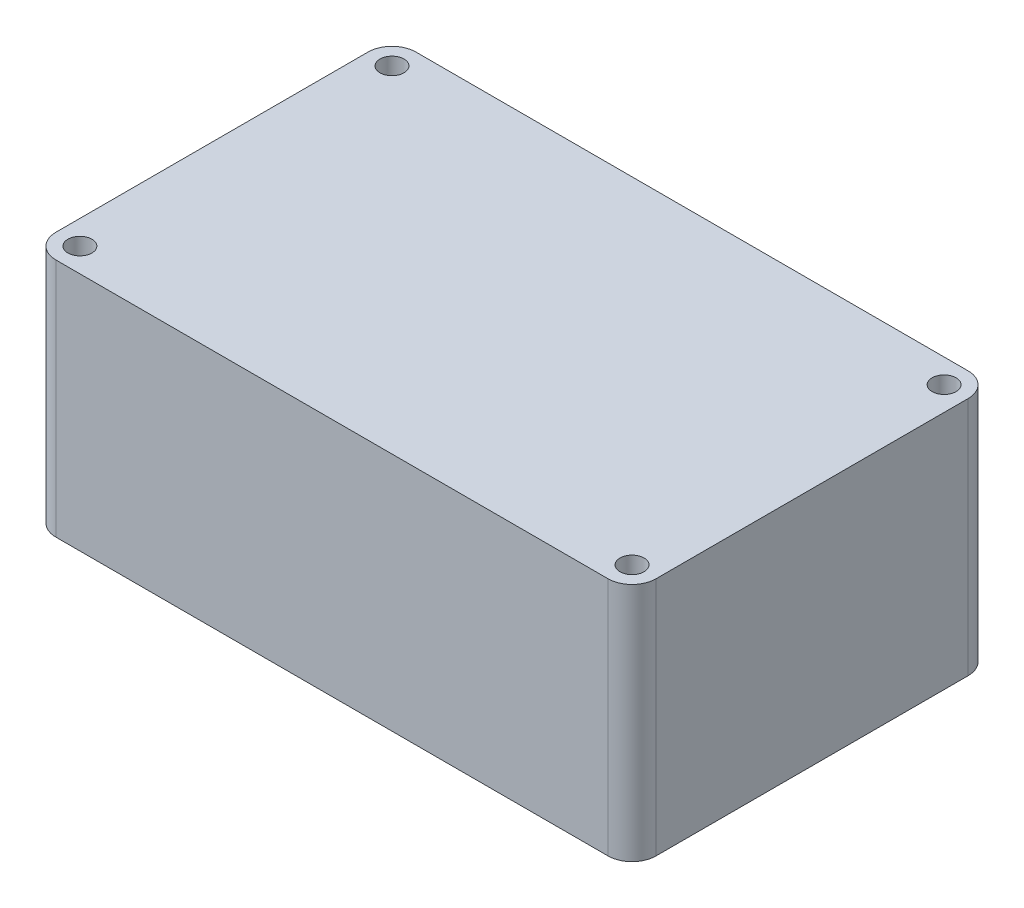
ISO-10303-21;
HEADER;
FILE_DESCRIPTION(('STEP AP214'),'2;1');
FILE_NAME('part.step','',(''),(''),'','','');
FILE_SCHEMA(('AUTOMOTIVE_DESIGN { 1 0 10303 214 1 1 1 1 }'));
ENDSEC;
DATA;
#1=APPLICATION_CONTEXT('core data for automotive mechanical design processes');
#2=APPLICATION_PROTOCOL_DEFINITION('international standard','automotive_design',2000,#1);
#3=PRODUCT_CONTEXT('',#1,'mechanical');
#4=PRODUCT('Part','Part','',(#3));
#5=PRODUCT_RELATED_PRODUCT_CATEGORY('part','',(#4));
#6=PRODUCT_DEFINITION_FORMATION('','',#4);
#7=PRODUCT_DEFINITION_CONTEXT('part definition',#1,'design');
#8=PRODUCT_DEFINITION('design','',#6,#7);
#9=PRODUCT_DEFINITION_SHAPE('','',#8);
#10=(LENGTH_UNIT() NAMED_UNIT(*) SI_UNIT(.MILLI.,.METRE.));
#11=(NAMED_UNIT(*) PLANE_ANGLE_UNIT() SI_UNIT($,.RADIAN.));
#12=(NAMED_UNIT(*) SI_UNIT($,.STERADIAN.) SOLID_ANGLE_UNIT());
#13=UNCERTAINTY_MEASURE_WITH_UNIT(LENGTH_MEASURE(1.E-05),#10,'distance_accuracy_value','');
#14=(GEOMETRIC_REPRESENTATION_CONTEXT(3) GLOBAL_UNCERTAINTY_ASSIGNED_CONTEXT((#13)) GLOBAL_UNIT_ASSIGNED_CONTEXT((#10,
#11,#12)) REPRESENTATION_CONTEXT('',''));
#15=CARTESIAN_POINT('',(0.,0.,0.));
#16=DIRECTION('',(0.,0.,1.));
#17=DIRECTION('',(1.,0.,0.));
#18=AXIS2_PLACEMENT_3D('',#15,#16,#17);
#19=CARTESIAN_POINT('',(-125.,100.,-75.));
#20=DIRECTION('',(1.,0.,0.));
#21=DIRECTION('',(0.,0.,-1.));
#22=AXIS2_PLACEMENT_3D('',#19,#20,#21);
#23=PLANE('',#22);
#24=DIRECTION('',(0.,0.,1.));
#25=VECTOR('',#24,1.);
#26=CARTESIAN_POINT('',(-125.,100.,-75.));
#27=LINE('',#26,#25);
#28=CARTESIAN_POINT('',(-125.,100.,-65.));
#29=VERTEX_POINT('',#28);
#30=CARTESIAN_POINT('',(-125.,100.,65.));
#31=VERTEX_POINT('',#30);
#32=EDGE_CURVE('E124',#29,#31,#27,.T.);
#33=ORIENTED_EDGE('',*,*,#32,.F.);
#34=DIRECTION('',(0.,-1.,0.));
#35=VECTOR('',#34,1.);
#36=CARTESIAN_POINT('',(-125.,100.,-65.));
#37=LINE('',#36,#35);
#38=CARTESIAN_POINT('',(-125.,0.,-65.));
#39=VERTEX_POINT('',#38);
#40=EDGE_CURVE('E109',#29,#39,#37,.T.);
#41=ORIENTED_EDGE('',*,*,#40,.T.);
#42=DIRECTION('',(0.,0.,1.));
#43=VECTOR('',#42,1.);
#44=CARTESIAN_POINT('',(-125.,0.,-75.));
#45=LINE('',#44,#43);
#46=CARTESIAN_POINT('',(-125.,0.,65.));
#47=VERTEX_POINT('',#46);
#48=EDGE_CURVE('E121',#39,#47,#45,.T.);
#49=ORIENTED_EDGE('',*,*,#48,.T.);
#50=DIRECTION('',(0.,-1.,0.));
#51=VECTOR('',#50,1.);
#52=CARTESIAN_POINT('',(-125.,100.,65.));
#53=LINE('',#52,#51);
#54=EDGE_CURVE('E126',#47,#31,#53,.F.);
#55=ORIENTED_EDGE('',*,*,#54,.T.);
#56=EDGE_LOOP('',(#33,#41,#49,#55));
#57=FACE_BOUND('',#56,.T.);
#58=ADVANCED_FACE('F39',(#57),#23,.F.);
#59=CARTESIAN_POINT('',(-125.,100.,75.));
#60=DIRECTION('',(0.,0.,-1.));
#61=DIRECTION('',(-1.,0.,0.));
#62=AXIS2_PLACEMENT_3D('',#59,#60,#61);
#63=PLANE('',#62);
#64=DIRECTION('',(1.,0.,0.));
#65=VECTOR('',#64,1.);
#66=CARTESIAN_POINT('',(-125.,0.,75.));
#67=LINE('',#66,#65);
#68=CARTESIAN_POINT('',(-115.,0.,75.));
#69=VERTEX_POINT('',#68);
#70=CARTESIAN_POINT('',(115.,0.,75.));
#71=VERTEX_POINT('',#70);
#72=EDGE_CURVE('E130',#69,#71,#67,.T.);
#73=ORIENTED_EDGE('',*,*,#72,.T.);
#74=DIRECTION('',(0.,-1.,0.));
#75=VECTOR('',#74,1.);
#76=CARTESIAN_POINT('',(115.,100.,75.));
#77=LINE('',#76,#75);
#78=CARTESIAN_POINT('',(115.,100.,75.));
#79=VERTEX_POINT('',#78);
#80=EDGE_CURVE('E11',#71,#79,#77,.F.);
#81=ORIENTED_EDGE('',*,*,#80,.T.);
#82=DIRECTION('',(1.,0.,0.));
#83=VECTOR('',#82,1.);
#84=CARTESIAN_POINT('',(-125.,100.,75.));
#85=LINE('',#84,#83);
#86=CARTESIAN_POINT('',(-115.,100.,75.));
#87=VERTEX_POINT('',#86);
#88=EDGE_CURVE('E170',#87,#79,#85,.T.);
#89=ORIENTED_EDGE('',*,*,#88,.F.);
#90=DIRECTION('',(0.,-1.,0.));
#91=VECTOR('',#90,1.);
#92=CARTESIAN_POINT('',(-115.,100.,75.));
#93=LINE('',#92,#91);
#94=EDGE_CURVE('E47',#87,#69,#93,.T.);
#95=ORIENTED_EDGE('',*,*,#94,.T.);
#96=EDGE_LOOP('',(#73,#81,#89,#95));
#97=FACE_BOUND('',#96,.T.);
#98=ADVANCED_FACE('F168',(#97),#63,.F.);
#99=CARTESIAN_POINT('',(125.,100.,-75.));
#100=DIRECTION('',(-1.,0.,0.));
#101=DIRECTION('',(0.,0.,1.));
#102=AXIS2_PLACEMENT_3D('',#99,#100,#101);
#103=PLANE('',#102);
#104=DIRECTION('',(0.,0.,-1.));
#105=VECTOR('',#104,1.);
#106=CARTESIAN_POINT('',(125.,0.,-75.));
#107=LINE('',#106,#105);
#108=CARTESIAN_POINT('',(125.,0.,65.));
#109=VERTEX_POINT('',#108);
#110=CARTESIAN_POINT('',(125.,0.,-65.));
#111=VERTEX_POINT('',#110);
#112=EDGE_CURVE('E134',#109,#111,#107,.T.);
#113=ORIENTED_EDGE('',*,*,#112,.T.);
#114=DIRECTION('',(0.,-1.,0.));
#115=VECTOR('',#114,1.);
#116=CARTESIAN_POINT('',(125.,100.,-65.));
#117=LINE('',#116,#115);
#118=CARTESIAN_POINT('',(125.,100.,-65.));
#119=VERTEX_POINT('',#118);
#120=EDGE_CURVE('E54',#111,#119,#117,.F.);
#121=ORIENTED_EDGE('',*,*,#120,.T.);
#122=DIRECTION('',(0.,0.,-1.));
#123=VECTOR('',#122,1.);
#124=CARTESIAN_POINT('',(125.,100.,-75.));
#125=LINE('',#124,#123);
#126=CARTESIAN_POINT('',(125.,100.,65.));
#127=VERTEX_POINT('',#126);
#128=EDGE_CURVE('E178',#127,#119,#125,.T.);
#129=ORIENTED_EDGE('',*,*,#128,.F.);
#130=DIRECTION('',(0.,-1.,0.));
#131=VECTOR('',#130,1.);
#132=CARTESIAN_POINT('',(125.,100.,65.));
#133=LINE('',#132,#131);
#134=EDGE_CURVE('E161',#127,#109,#133,.T.);
#135=ORIENTED_EDGE('',*,*,#134,.T.);
#136=EDGE_LOOP('',(#113,#121,#129,#135));
#137=FACE_BOUND('',#136,.T.);
#138=ADVANCED_FACE('F177',(#137),#103,.F.);
#139=CARTESIAN_POINT('',(-125.,100.,-75.));
#140=DIRECTION('',(0.,0.,1.));
#141=DIRECTION('',(1.,0.,0.));
#142=AXIS2_PLACEMENT_3D('',#139,#140,#141);
#143=PLANE('',#142);
#144=DIRECTION('',(-1.,0.,0.));
#145=VECTOR('',#144,1.);
#146=CARTESIAN_POINT('',(-125.,0.,-75.));
#147=LINE('',#146,#145);
#148=CARTESIAN_POINT('',(115.,0.,-75.));
#149=VERTEX_POINT('',#148);
#150=CARTESIAN_POINT('',(-115.,0.,-75.));
#151=VERTEX_POINT('',#150);
#152=EDGE_CURVE('E144',#149,#151,#147,.T.);
#153=ORIENTED_EDGE('',*,*,#152,.T.);
#154=DIRECTION('',(0.,-1.,0.));
#155=VECTOR('',#154,1.);
#156=CARTESIAN_POINT('',(-115.,100.,-75.));
#157=LINE('',#156,#155);
#158=CARTESIAN_POINT('',(-115.,100.,-75.));
#159=VERTEX_POINT('',#158);
#160=EDGE_CURVE('E110',#151,#159,#157,.F.);
#161=ORIENTED_EDGE('',*,*,#160,.T.);
#162=DIRECTION('',(-1.,0.,0.));
#163=VECTOR('',#162,1.);
#164=CARTESIAN_POINT('',(-125.,100.,-75.));
#165=LINE('',#164,#163);
#166=CARTESIAN_POINT('',(115.,100.,-75.));
#167=VERTEX_POINT('',#166);
#168=EDGE_CURVE('E140',#167,#159,#165,.T.);
#169=ORIENTED_EDGE('',*,*,#168,.F.);
#170=DIRECTION('',(0.,-1.,0.));
#171=VECTOR('',#170,1.);
#172=CARTESIAN_POINT('',(115.,100.,-75.));
#173=LINE('',#172,#171);
#174=EDGE_CURVE('E115',#167,#149,#173,.T.);
#175=ORIENTED_EDGE('',*,*,#174,.T.);
#176=EDGE_LOOP('',(#153,#161,#169,#175));
#177=FACE_BOUND('',#176,.T.);
#178=ADVANCED_FACE('F217',(#177),#143,.F.);
#179=CARTESIAN_POINT('',(0.,100.,0.));
#180=DIRECTION('',(0.,1.,0.));
#181=DIRECTION('',(0.,0.,1.));
#182=AXIS2_PLACEMENT_3D('',#179,#180,#181);
#183=PLANE('',#182);
#184=CARTESIAN_POINT('',(115.,100.,65.));
#185=DIRECTION('',(0.,1.,0.));
#186=DIRECTION('',(0.,0.,-1.));
#187=AXIS2_PLACEMENT_3D('',#184,#185,#186);
#188=CIRCLE('',#187,5.00000000000001);
#189=CARTESIAN_POINT('',(115.,100.,60.));
#190=VERTEX_POINT('',#189);
#191=EDGE_CURVE('E199',#190,#190,#188,.T.);
#192=ORIENTED_EDGE('',*,*,#191,.F.);
#193=EDGE_LOOP('',(#192));
#194=FACE_BOUND('',#193,.T.);
#195=CARTESIAN_POINT('',(-115.,100.,65.));
#196=DIRECTION('',(0.,-1.,0.));
#197=DIRECTION('',(0.,0.,-1.));
#198=AXIS2_PLACEMENT_3D('',#195,#196,#197);
#199=CIRCLE('',#198,5.00000000000001);
#200=CARTESIAN_POINT('',(-115.,100.,60.));
#201=VERTEX_POINT('',#200);
#202=EDGE_CURVE('E193',#201,#201,#199,.T.);
#203=ORIENTED_EDGE('',*,*,#202,.T.);
#204=EDGE_LOOP('',(#203));
#205=FACE_BOUND('',#204,.T.);
#206=CARTESIAN_POINT('',(115.,100.,-65.));
#207=DIRECTION('',(0.,-1.,0.));
#208=DIRECTION('',(0.,0.,1.));
#209=AXIS2_PLACEMENT_3D('',#206,#207,#208);
#210=CIRCLE('',#209,5.00000000000001);
#211=CARTESIAN_POINT('',(115.,100.,-60.));
#212=VERTEX_POINT('',#211);
#213=EDGE_CURVE('E187',#212,#212,#210,.T.);
#214=ORIENTED_EDGE('',*,*,#213,.T.);
#215=EDGE_LOOP('',(#214));
#216=FACE_BOUND('',#215,.T.);
#217=CARTESIAN_POINT('',(-115.,100.,-65.));
#218=DIRECTION('',(0.,1.,0.));
#219=DIRECTION('',(0.,0.,1.));
#220=AXIS2_PLACEMENT_3D('',#217,#218,#219);
#221=CIRCLE('',#220,5.00000000000001);
#222=CARTESIAN_POINT('',(-115.,100.,-60.));
#223=VERTEX_POINT('',#222);
#224=EDGE_CURVE('E137',#223,#223,#221,.T.);
#225=ORIENTED_EDGE('',*,*,#224,.F.);
#226=EDGE_LOOP('',(#225));
#227=FACE_BOUND('',#226,.T.);
#228=ORIENTED_EDGE('',*,*,#168,.T.);
#229=CARTESIAN_POINT('',(-115.,100.,-65.));
#230=DIRECTION('',(0.,1.,0.));
#231=DIRECTION('',(0.,0.,1.));
#232=AXIS2_PLACEMENT_3D('',#229,#230,#231);
#233=CIRCLE('',#232,10.);
#234=EDGE_CURVE('E159',#159,#29,#233,.T.);
#235=ORIENTED_EDGE('',*,*,#234,.T.);
#236=ORIENTED_EDGE('',*,*,#32,.T.);
#237=CARTESIAN_POINT('',(-115.,100.,65.));
#238=DIRECTION('',(0.,1.,0.));
#239=DIRECTION('',(0.,0.,1.));
#240=AXIS2_PLACEMENT_3D('',#237,#238,#239);
#241=CIRCLE('',#240,10.);
#242=EDGE_CURVE('E154',#31,#87,#241,.T.);
#243=ORIENTED_EDGE('',*,*,#242,.T.);
#244=ORIENTED_EDGE('',*,*,#88,.T.);
#245=CARTESIAN_POINT('',(115.,100.,65.));
#246=DIRECTION('',(0.,1.,0.));
#247=DIRECTION('',(0.,0.,1.));
#248=AXIS2_PLACEMENT_3D('',#245,#246,#247);
#249=CIRCLE('',#248,10.);
#250=EDGE_CURVE('E61',#79,#127,#249,.T.);
#251=ORIENTED_EDGE('',*,*,#250,.T.);
#252=ORIENTED_EDGE('',*,*,#128,.T.);
#253=CARTESIAN_POINT('',(115.,100.,-65.));
#254=DIRECTION('',(0.,1.,0.));
#255=DIRECTION('',(0.,0.,1.));
#256=AXIS2_PLACEMENT_3D('',#253,#254,#255);
#257=CIRCLE('',#256,10.);
#258=EDGE_CURVE('E157',#119,#167,#257,.T.);
#259=ORIENTED_EDGE('',*,*,#258,.T.);
#260=EDGE_LOOP('',(#228,#235,#236,#243,#244,#251,#252,#259));
#261=FACE_BOUND('',#260,.T.);
#262=ADVANCED_FACE('F214',(#194,#205,#216,#227,#261),#183,.T.);
#263=CARTESIAN_POINT('',(0.,0.,0.));
#264=DIRECTION('',(0.,1.,0.));
#265=DIRECTION('',(0.,0.,1.));
#266=AXIS2_PLACEMENT_3D('',#263,#264,#265);
#267=PLANE('',#266);
#268=CARTESIAN_POINT('',(115.,0.,65.));
#269=DIRECTION('',(0.,1.,0.));
#270=DIRECTION('',(0.,0.,-1.));
#271=AXIS2_PLACEMENT_3D('',#268,#269,#270);
#272=CIRCLE('',#271,5.00000000000001);
#273=CARTESIAN_POINT('',(115.,0.,60.));
#274=VERTEX_POINT('',#273);
#275=EDGE_CURVE('E196',#274,#274,#272,.T.);
#276=ORIENTED_EDGE('',*,*,#275,.T.);
#277=EDGE_LOOP('',(#276));
#278=FACE_BOUND('',#277,.T.);
#279=CARTESIAN_POINT('',(-115.,0.,65.));
#280=DIRECTION('',(0.,-1.,0.));
#281=DIRECTION('',(0.,0.,-1.));
#282=AXIS2_PLACEMENT_3D('',#279,#280,#281);
#283=CIRCLE('',#282,5.00000000000001);
#284=CARTESIAN_POINT('',(-115.,0.,60.));
#285=VERTEX_POINT('',#284);
#286=EDGE_CURVE('E190',#285,#285,#283,.T.);
#287=ORIENTED_EDGE('',*,*,#286,.F.);
#288=EDGE_LOOP('',(#287));
#289=FACE_BOUND('',#288,.T.);
#290=CARTESIAN_POINT('',(115.,0.,-65.));
#291=DIRECTION('',(0.,-1.,0.));
#292=DIRECTION('',(0.,0.,1.));
#293=AXIS2_PLACEMENT_3D('',#290,#291,#292);
#294=CIRCLE('',#293,5.00000000000001);
#295=CARTESIAN_POINT('',(115.,0.,-60.));
#296=VERTEX_POINT('',#295);
#297=EDGE_CURVE('E185',#296,#296,#294,.T.);
#298=ORIENTED_EDGE('',*,*,#297,.F.);
#299=EDGE_LOOP('',(#298));
#300=FACE_BOUND('',#299,.T.);
#301=CARTESIAN_POINT('',(-115.,0.,-65.));
#302=DIRECTION('',(0.,1.,0.));
#303=DIRECTION('',(0.,0.,1.));
#304=AXIS2_PLACEMENT_3D('',#301,#302,#303);
#305=CIRCLE('',#304,5.00000000000001);
#306=CARTESIAN_POINT('',(-115.,0.,-60.));
#307=VERTEX_POINT('',#306);
#308=EDGE_CURVE('E131',#307,#307,#305,.T.);
#309=ORIENTED_EDGE('',*,*,#308,.T.);
#310=EDGE_LOOP('',(#309));
#311=FACE_BOUND('',#310,.T.);
#312=ORIENTED_EDGE('',*,*,#48,.F.);
#313=CARTESIAN_POINT('',(-115.,0.,-65.));
#314=DIRECTION('',(0.,1.,0.));
#315=DIRECTION('',(0.,0.,1.));
#316=AXIS2_PLACEMENT_3D('',#313,#314,#315);
#317=CIRCLE('',#316,10.);
#318=EDGE_CURVE('E105',#39,#151,#317,.F.);
#319=ORIENTED_EDGE('',*,*,#318,.T.);
#320=ORIENTED_EDGE('',*,*,#152,.F.);
#321=CARTESIAN_POINT('',(115.,0.,-65.));
#322=DIRECTION('',(0.,1.,0.));
#323=DIRECTION('',(0.,0.,1.));
#324=AXIS2_PLACEMENT_3D('',#321,#322,#323);
#325=CIRCLE('',#324,10.);
#326=EDGE_CURVE('E116',#149,#111,#325,.F.);
#327=ORIENTED_EDGE('',*,*,#326,.T.);
#328=ORIENTED_EDGE('',*,*,#112,.F.);
#329=CARTESIAN_POINT('',(115.,0.,65.));
#330=DIRECTION('',(0.,1.,0.));
#331=DIRECTION('',(0.,0.,1.));
#332=AXIS2_PLACEMENT_3D('',#329,#330,#331);
#333=CIRCLE('',#332,10.);
#334=EDGE_CURVE('E148',#109,#71,#333,.F.);
#335=ORIENTED_EDGE('',*,*,#334,.T.);
#336=ORIENTED_EDGE('',*,*,#72,.F.);
#337=CARTESIAN_POINT('',(-115.,0.,65.));
#338=DIRECTION('',(0.,1.,0.));
#339=DIRECTION('',(0.,0.,1.));
#340=AXIS2_PLACEMENT_3D('',#337,#338,#339);
#341=CIRCLE('',#340,10.);
#342=EDGE_CURVE('E125',#69,#47,#341,.F.);
#343=ORIENTED_EDGE('',*,*,#342,.T.);
#344=EDGE_LOOP('',(#312,#319,#320,#327,#328,#335,#336,#343));
#345=FACE_BOUND('',#344,.T.);
#346=ADVANCED_FACE('F128',(#278,#289,#300,#311,#345),#267,.F.);
#347=CARTESIAN_POINT('',(-115.,100.,-65.));
#348=DIRECTION('',(0.,-1.,0.));
#349=DIRECTION('',(0.,0.,-1.));
#350=AXIS2_PLACEMENT_3D('',#347,#348,#349);
#351=CYLINDRICAL_SURFACE('',#350,10.);
#352=ORIENTED_EDGE('',*,*,#234,.F.);
#353=ORIENTED_EDGE('',*,*,#160,.F.);
#354=ORIENTED_EDGE('',*,*,#318,.F.);
#355=ORIENTED_EDGE('',*,*,#40,.F.);
#356=EDGE_LOOP('',(#352,#353,#354,#355));
#357=FACE_BOUND('',#356,.T.);
#358=ADVANCED_FACE('F108',(#357),#351,.T.);
#359=CARTESIAN_POINT('',(115.,100.,-65.));
#360=DIRECTION('',(0.,-1.,0.));
#361=DIRECTION('',(0.,0.,-1.));
#362=AXIS2_PLACEMENT_3D('',#359,#360,#361);
#363=CYLINDRICAL_SURFACE('',#362,10.);
#364=ORIENTED_EDGE('',*,*,#258,.F.);
#365=ORIENTED_EDGE('',*,*,#120,.F.);
#366=ORIENTED_EDGE('',*,*,#326,.F.);
#367=ORIENTED_EDGE('',*,*,#174,.F.);
#368=EDGE_LOOP('',(#364,#365,#366,#367));
#369=FACE_BOUND('',#368,.T.);
#370=ADVANCED_FACE('F228',(#369),#363,.T.);
#371=CARTESIAN_POINT('',(115.,100.,65.));
#372=DIRECTION('',(0.,-1.,0.));
#373=DIRECTION('',(0.,0.,-1.));
#374=AXIS2_PLACEMENT_3D('',#371,#372,#373);
#375=CYLINDRICAL_SURFACE('',#374,10.);
#376=ORIENTED_EDGE('',*,*,#250,.F.);
#377=ORIENTED_EDGE('',*,*,#80,.F.);
#378=ORIENTED_EDGE('',*,*,#334,.F.);
#379=ORIENTED_EDGE('',*,*,#134,.F.);
#380=EDGE_LOOP('',(#376,#377,#378,#379));
#381=FACE_BOUND('',#380,.T.);
#382=ADVANCED_FACE('F176',(#381),#375,.T.);
#383=CARTESIAN_POINT('',(-115.,100.,65.));
#384=DIRECTION('',(0.,-1.,0.));
#385=DIRECTION('',(0.,0.,-1.));
#386=AXIS2_PLACEMENT_3D('',#383,#384,#385);
#387=CYLINDRICAL_SURFACE('',#386,10.);
#388=ORIENTED_EDGE('',*,*,#242,.F.);
#389=ORIENTED_EDGE('',*,*,#54,.F.);
#390=ORIENTED_EDGE('',*,*,#342,.F.);
#391=ORIENTED_EDGE('',*,*,#94,.F.);
#392=EDGE_LOOP('',(#388,#389,#390,#391));
#393=FACE_BOUND('',#392,.T.);
#394=ADVANCED_FACE('F41',(#393),#387,.T.);
#395=CARTESIAN_POINT('',(-115.,0.,-65.));
#396=DIRECTION('',(0.,1.,0.));
#397=DIRECTION('',(0.,0.,1.));
#398=AXIS2_PLACEMENT_3D('',#395,#396,#397);
#399=CYLINDRICAL_SURFACE('',#398,5.00000000000001);
#400=ORIENTED_EDGE('',*,*,#308,.F.);
#401=EDGE_LOOP('',(#400));
#402=FACE_BOUND('',#401,.T.);
#403=ORIENTED_EDGE('',*,*,#224,.T.);
#404=EDGE_LOOP('',(#403));
#405=FACE_BOUND('',#404,.T.);
#406=ADVANCED_FACE('F249',(#402,#405),#399,.F.);
#407=CARTESIAN_POINT('',(115.,0.,-65.));
#408=DIRECTION('',(0.,1.,0.));
#409=DIRECTION('',(0.,0.,1.));
#410=AXIS2_PLACEMENT_3D('',#407,#408,#409);
#411=CYLINDRICAL_SURFACE('',#410,5.00000000000001);
#412=ORIENTED_EDGE('',*,*,#297,.T.);
#413=EDGE_LOOP('',(#412));
#414=FACE_BOUND('',#413,.T.);
#415=ORIENTED_EDGE('',*,*,#213,.F.);
#416=EDGE_LOOP('',(#415));
#417=FACE_BOUND('',#416,.T.);
#418=ADVANCED_FACE('F252',(#414,#417),#411,.F.);
#419=CARTESIAN_POINT('',(-115.,0.,65.));
#420=DIRECTION('',(0.,1.,0.));
#421=DIRECTION('',(0.,0.,1.));
#422=AXIS2_PLACEMENT_3D('',#419,#420,#421);
#423=CYLINDRICAL_SURFACE('',#422,5.00000000000001);
#424=ORIENTED_EDGE('',*,*,#286,.T.);
#425=EDGE_LOOP('',(#424));
#426=FACE_BOUND('',#425,.T.);
#427=ORIENTED_EDGE('',*,*,#202,.F.);
#428=EDGE_LOOP('',(#427));
#429=FACE_BOUND('',#428,.T.);
#430=ADVANCED_FACE('F210',(#426,#429),#423,.F.);
#431=CARTESIAN_POINT('',(115.,0.,65.));
#432=DIRECTION('',(0.,1.,0.));
#433=DIRECTION('',(0.,0.,1.));
#434=AXIS2_PLACEMENT_3D('',#431,#432,#433);
#435=CYLINDRICAL_SURFACE('',#434,5.00000000000001);
#436=ORIENTED_EDGE('',*,*,#275,.F.);
#437=EDGE_LOOP('',(#436));
#438=FACE_BOUND('',#437,.T.);
#439=ORIENTED_EDGE('',*,*,#191,.T.);
#440=EDGE_LOOP('',(#439));
#441=FACE_BOUND('',#440,.T.);
#442=ADVANCED_FACE('F207',(#438,#441),#435,.F.);
#443=CLOSED_SHELL('',(#58,#98,#138,#178,#262,#346,#358,#370,#382,#394,#406,#418,#430,#442));
#444=MANIFOLD_SOLID_BREP('B2',#443);
#445=ADVANCED_BREP_SHAPE_REPRESENTATION('',(#18,#444),#14);
#446=SHAPE_DEFINITION_REPRESENTATION(#9,#445);
ENDSEC;
END-ISO-10303-21;
